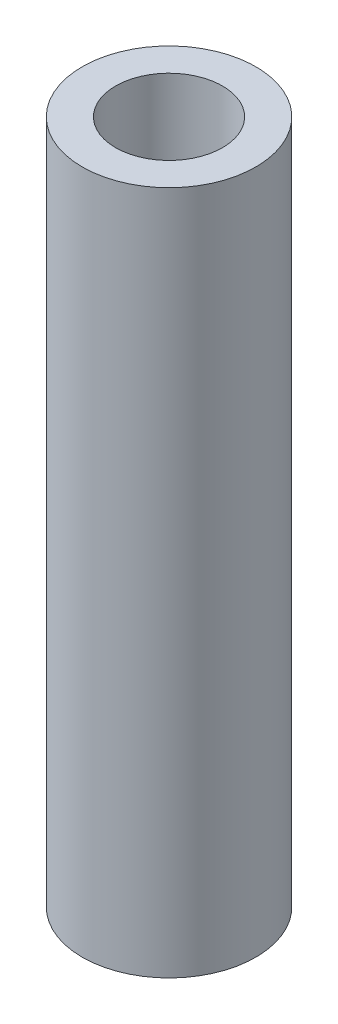
ISO-10303-21;
HEADER;
FILE_DESCRIPTION(('STEP AP214'),'2;1');
FILE_NAME('part.step','',(''),(''),'','','');
FILE_SCHEMA(('AUTOMOTIVE_DESIGN { 1 0 10303 214 1 1 1 1 }'));
ENDSEC;
DATA;
#1=APPLICATION_CONTEXT('core data for automotive mechanical design processes');
#2=APPLICATION_PROTOCOL_DEFINITION('international standard','automotive_design',2000,#1);
#3=PRODUCT_CONTEXT('',#1,'mechanical');
#4=PRODUCT('Part','Part','',(#3));
#5=PRODUCT_RELATED_PRODUCT_CATEGORY('part','',(#4));
#6=PRODUCT_DEFINITION_FORMATION('','',#4);
#7=PRODUCT_DEFINITION_CONTEXT('part definition',#1,'design');
#8=PRODUCT_DEFINITION('design','',#6,#7);
#9=PRODUCT_DEFINITION_SHAPE('','',#8);
#10=(LENGTH_UNIT() NAMED_UNIT(*) SI_UNIT(.MILLI.,.METRE.));
#11=(NAMED_UNIT(*) PLANE_ANGLE_UNIT() SI_UNIT($,.RADIAN.));
#12=(NAMED_UNIT(*) SI_UNIT($,.STERADIAN.) SOLID_ANGLE_UNIT());
#13=UNCERTAINTY_MEASURE_WITH_UNIT(LENGTH_MEASURE(1.E-05),#10,'distance_accuracy_value','');
#14=(GEOMETRIC_REPRESENTATION_CONTEXT(3) GLOBAL_UNCERTAINTY_ASSIGNED_CONTEXT((#13)) GLOBAL_UNIT_ASSIGNED_CONTEXT((#10,
#11,#12)) REPRESENTATION_CONTEXT('',''));
#15=CARTESIAN_POINT('',(0.,0.,0.));
#16=DIRECTION('',(0.,0.,1.));
#17=DIRECTION('',(1.,0.,0.));
#18=AXIS2_PLACEMENT_3D('',#15,#16,#17);
#19=CARTESIAN_POINT('',(0.,20.32,0.));
#20=DIRECTION('',(0.,1.,0.));
#21=DIRECTION('',(0.,0.,1.));
#22=AXIS2_PLACEMENT_3D('',#19,#20,#21);
#23=PLANE('',#22);
#24=CARTESIAN_POINT('',(0.,20.32,0.));
#25=DIRECTION('',(0.,1.,0.));
#26=DIRECTION('',(0.,0.,1.));
#27=AXIS2_PLACEMENT_3D('',#24,#25,#26);
#28=CIRCLE('',#27,2.57778619923067);
#29=CARTESIAN_POINT('',(0.,20.32,2.57778619923067));
#30=VERTEX_POINT('',#29);
#31=EDGE_CURVE('E10',#30,#30,#28,.T.);
#32=ORIENTED_EDGE('',*,*,#31,.T.);
#33=EDGE_LOOP('',(#32));
#34=FACE_BOUND('',#33,.T.);
#35=CARTESIAN_POINT('',(0.,20.32,0.));
#36=DIRECTION('',(0.,1.,0.));
#37=DIRECTION('',(0.,0.,1.));
#38=AXIS2_PLACEMENT_3D('',#35,#36,#37);
#39=CIRCLE('',#38,1.5875);
#40=CARTESIAN_POINT('',(0.,20.32,1.5875));
#41=VERTEX_POINT('',#40);
#42=EDGE_CURVE('E48',#41,#41,#39,.T.);
#43=ORIENTED_EDGE('',*,*,#42,.F.);
#44=EDGE_LOOP('',(#43));
#45=FACE_BOUND('',#44,.T.);
#46=ADVANCED_FACE('F37',(#34,#45),#23,.T.);
#47=CARTESIAN_POINT('',(0.,0.,0.));
#48=DIRECTION('',(0.,1.,0.));
#49=DIRECTION('',(0.,0.,1.));
#50=AXIS2_PLACEMENT_3D('',#47,#48,#49);
#51=PLANE('',#50);
#52=CARTESIAN_POINT('',(0.,0.,0.));
#53=DIRECTION('',(0.,1.,0.));
#54=DIRECTION('',(0.,0.,1.));
#55=AXIS2_PLACEMENT_3D('',#52,#53,#54);
#56=CIRCLE('',#55,2.57778619923067);
#57=CARTESIAN_POINT('',(0.,0.,2.57778619923067));
#58=VERTEX_POINT('',#57);
#59=EDGE_CURVE('E41',#58,#58,#56,.T.);
#60=ORIENTED_EDGE('',*,*,#59,.F.);
#61=EDGE_LOOP('',(#60));
#62=FACE_BOUND('',#61,.T.);
#63=CARTESIAN_POINT('',(0.,0.,0.));
#64=DIRECTION('',(0.,1.,0.));
#65=DIRECTION('',(0.,0.,1.));
#66=AXIS2_PLACEMENT_3D('',#63,#64,#65);
#67=CIRCLE('',#66,1.5875);
#68=CARTESIAN_POINT('',(0.,0.,1.5875));
#69=VERTEX_POINT('',#68);
#70=EDGE_CURVE('E50',#69,#69,#67,.T.);
#71=ORIENTED_EDGE('',*,*,#70,.T.);
#72=EDGE_LOOP('',(#71));
#73=FACE_BOUND('',#72,.T.);
#74=ADVANCED_FACE('F60',(#62,#73),#51,.F.);
#75=CARTESIAN_POINT('',(0.,20.32,0.));
#76=DIRECTION('',(0.,-1.,0.));
#77=DIRECTION('',(0.,0.,-1.));
#78=AXIS2_PLACEMENT_3D('',#75,#76,#77);
#79=CYLINDRICAL_SURFACE('',#78,2.57778619923067);
#80=ORIENTED_EDGE('',*,*,#31,.F.);
#81=EDGE_LOOP('',(#80));
#82=FACE_BOUND('',#81,.T.);
#83=ORIENTED_EDGE('',*,*,#59,.T.);
#84=EDGE_LOOP('',(#83));
#85=FACE_BOUND('',#84,.T.);
#86=ADVANCED_FACE('F39',(#82,#85),#79,.T.);
#87=CARTESIAN_POINT('',(0.,20.32,0.));
#88=DIRECTION('',(0.,-1.,0.));
#89=DIRECTION('',(0.,0.,-1.));
#90=AXIS2_PLACEMENT_3D('',#87,#88,#89);
#91=CYLINDRICAL_SURFACE('',#90,1.5875);
#92=ORIENTED_EDGE('',*,*,#42,.T.);
#93=EDGE_LOOP('',(#92));
#94=FACE_BOUND('',#93,.T.);
#95=ORIENTED_EDGE('',*,*,#70,.F.);
#96=EDGE_LOOP('',(#95));
#97=FACE_BOUND('',#96,.T.);
#98=ADVANCED_FACE('F56',(#94,#97),#91,.F.);
#99=CLOSED_SHELL('',(#46,#74,#86,#98));
#100=MANIFOLD_SOLID_BREP('B2',#99);
#101=ADVANCED_BREP_SHAPE_REPRESENTATION('',(#18,#100),#14);
#102=SHAPE_DEFINITION_REPRESENTATION(#9,#101);
ENDSEC;
END-ISO-10303-21;
